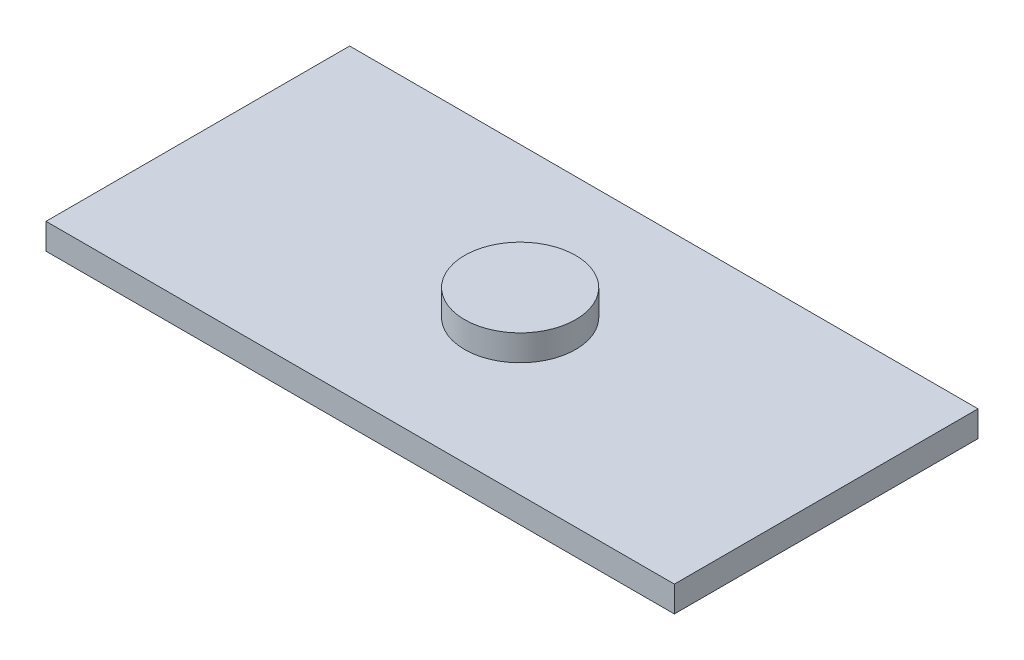
ISO-10303-21;
HEADER;
FILE_DESCRIPTION(('STEP AP214'),'2;1');
FILE_NAME('part.step','',(''),(''),'','','');
FILE_SCHEMA(('AUTOMOTIVE_DESIGN { 1 0 10303 214 1 1 1 1 }'));
ENDSEC;
DATA;
#1=APPLICATION_CONTEXT('core data for automotive mechanical design processes');
#2=APPLICATION_PROTOCOL_DEFINITION('international standard','automotive_design',2000,#1);
#3=PRODUCT_CONTEXT('',#1,'mechanical');
#4=PRODUCT('Part','Part','',(#3));
#5=PRODUCT_RELATED_PRODUCT_CATEGORY('part','',(#4));
#6=PRODUCT_DEFINITION_FORMATION('','',#4);
#7=PRODUCT_DEFINITION_CONTEXT('part definition',#1,'design');
#8=PRODUCT_DEFINITION('design','',#6,#7);
#9=PRODUCT_DEFINITION_SHAPE('','',#8);
#10=(LENGTH_UNIT() NAMED_UNIT(*) SI_UNIT(.MILLI.,.METRE.));
#11=(NAMED_UNIT(*) PLANE_ANGLE_UNIT() SI_UNIT($,.RADIAN.));
#12=(NAMED_UNIT(*) SI_UNIT($,.STERADIAN.) SOLID_ANGLE_UNIT());
#13=UNCERTAINTY_MEASURE_WITH_UNIT(LENGTH_MEASURE(1.E-05),#10,'distance_accuracy_value','');
#14=(GEOMETRIC_REPRESENTATION_CONTEXT(3) GLOBAL_UNCERTAINTY_ASSIGNED_CONTEXT((#13)) GLOBAL_UNIT_ASSIGNED_CONTEXT((#10,
#11,#12)) REPRESENTATION_CONTEXT('',''));
#15=CARTESIAN_POINT('',(0.,0.,0.));
#16=DIRECTION('',(0.,0.,1.));
#17=DIRECTION('',(1.,0.,0.));
#18=AXIS2_PLACEMENT_3D('',#15,#16,#17);
#19=CARTESIAN_POINT('',(0.,2.5,0.));
#20=DIRECTION('',(1.,0.,0.));
#21=DIRECTION('',(0.,0.,-1.));
#22=AXIS2_PLACEMENT_3D('',#19,#20,#21);
#23=PLANE('',#22);
#24=DIRECTION('',(0.,0.,1.));
#25=VECTOR('',#24,1.);
#26=CARTESIAN_POINT('',(0.,0.,0.));
#27=LINE('',#26,#25);
#28=CARTESIAN_POINT('',(0.,0.,-29.319524904934));
#29=VERTEX_POINT('',#28);
#30=CARTESIAN_POINT('',(0.,0.,0.));
#31=VERTEX_POINT('',#30);
#32=EDGE_CURVE('E110',#29,#31,#27,.T.);
#33=ORIENTED_EDGE('',*,*,#32,.T.);
#34=DIRECTION('',(0.,-1.,0.));
#35=VECTOR('',#34,1.);
#36=CARTESIAN_POINT('',(0.,2.5,0.));
#37=LINE('',#36,#35);
#38=CARTESIAN_POINT('',(0.,2.5,0.));
#39=VERTEX_POINT('',#38);
#40=EDGE_CURVE('E42',#39,#31,#37,.T.);
#41=ORIENTED_EDGE('',*,*,#40,.F.);
#42=DIRECTION('',(0.,0.,1.));
#43=VECTOR('',#42,1.);
#44=CARTESIAN_POINT('',(0.,2.5,0.));
#45=LINE('',#44,#43);
#46=CARTESIAN_POINT('',(0.,2.5,-29.319524904934));
#47=VERTEX_POINT('',#46);
#48=EDGE_CURVE('E93',#47,#39,#45,.T.);
#49=ORIENTED_EDGE('',*,*,#48,.F.);
#50=DIRECTION('',(0.,-1.,0.));
#51=VECTOR('',#50,1.);
#52=CARTESIAN_POINT('',(0.,2.5,-29.319524904934));
#53=LINE('',#52,#51);
#54=EDGE_CURVE('E106',#47,#29,#53,.T.);
#55=ORIENTED_EDGE('',*,*,#54,.T.);
#56=EDGE_LOOP('',(#33,#41,#49,#55));
#57=FACE_BOUND('',#56,.T.);
#58=ADVANCED_FACE('F39',(#57),#23,.F.);
#59=CARTESIAN_POINT('',(0.,2.5,0.));
#60=DIRECTION('',(0.,0.,-1.));
#61=DIRECTION('',(-1.,0.,0.));
#62=AXIS2_PLACEMENT_3D('',#59,#60,#61);
#63=PLANE('',#62);
#64=DIRECTION('',(1.,0.,0.));
#65=VECTOR('',#64,1.);
#66=CARTESIAN_POINT('',(0.,0.,0.));
#67=LINE('',#66,#65);
#68=CARTESIAN_POINT('',(60.6751279282662,0.,0.));
#69=VERTEX_POINT('',#68);
#70=EDGE_CURVE('E99',#31,#69,#67,.T.);
#71=ORIENTED_EDGE('',*,*,#70,.T.);
#72=DIRECTION('',(0.,-1.,0.));
#73=VECTOR('',#72,1.);
#74=CARTESIAN_POINT('',(60.6751279282662,2.5,0.));
#75=LINE('',#74,#73);
#76=CARTESIAN_POINT('',(60.6751279282662,2.5,0.));
#77=VERTEX_POINT('',#76);
#78=EDGE_CURVE('E97',#77,#69,#75,.T.);
#79=ORIENTED_EDGE('',*,*,#78,.F.);
#80=DIRECTION('',(1.,0.,0.));
#81=VECTOR('',#80,1.);
#82=CARTESIAN_POINT('',(0.,2.5,0.));
#83=LINE('',#82,#81);
#84=EDGE_CURVE('E88',#39,#77,#83,.T.);
#85=ORIENTED_EDGE('',*,*,#84,.F.);
#86=ORIENTED_EDGE('',*,*,#40,.T.);
#87=EDGE_LOOP('',(#71,#79,#85,#86));
#88=FACE_BOUND('',#87,.T.);
#89=ADVANCED_FACE('F98',(#88),#63,.F.);
#90=CARTESIAN_POINT('',(60.6751279282662,2.5,0.));
#91=DIRECTION('',(-1.,0.,0.));
#92=DIRECTION('',(0.,0.,1.));
#93=AXIS2_PLACEMENT_3D('',#90,#91,#92);
#94=PLANE('',#93);
#95=DIRECTION('',(0.,0.,-1.));
#96=VECTOR('',#95,1.);
#97=CARTESIAN_POINT('',(60.6751279282662,0.,0.));
#98=LINE('',#97,#96);
#99=CARTESIAN_POINT('',(60.6751279282662,0.,-29.319524904934));
#100=VERTEX_POINT('',#99);
#101=EDGE_CURVE('E74',#69,#100,#98,.T.);
#102=ORIENTED_EDGE('',*,*,#101,.T.);
#103=DIRECTION('',(0.,-1.,0.));
#104=VECTOR('',#103,1.);
#105=CARTESIAN_POINT('',(60.6751279282662,2.5,-29.319524904934));
#106=LINE('',#105,#104);
#107=CARTESIAN_POINT('',(60.6751279282662,2.5,-29.319524904934));
#108=VERTEX_POINT('',#107);
#109=EDGE_CURVE('E101',#108,#100,#106,.T.);
#110=ORIENTED_EDGE('',*,*,#109,.F.);
#111=DIRECTION('',(0.,0.,-1.));
#112=VECTOR('',#111,1.);
#113=CARTESIAN_POINT('',(60.6751279282662,2.5,0.));
#114=LINE('',#113,#112);
#115=EDGE_CURVE('E91',#77,#108,#114,.T.);
#116=ORIENTED_EDGE('',*,*,#115,.F.);
#117=ORIENTED_EDGE('',*,*,#78,.T.);
#118=EDGE_LOOP('',(#102,#110,#116,#117));
#119=FACE_BOUND('',#118,.T.);
#120=ADVANCED_FACE('F102',(#119),#94,.F.);
#121=CARTESIAN_POINT('',(0.,2.5,-29.319524904934));
#122=DIRECTION('',(0.,0.,1.));
#123=DIRECTION('',(1.,0.,0.));
#124=AXIS2_PLACEMENT_3D('',#121,#122,#123);
#125=PLANE('',#124);
#126=DIRECTION('',(-1.,0.,0.));
#127=VECTOR('',#126,1.);
#128=CARTESIAN_POINT('',(0.,0.,-29.319524904934));
#129=LINE('',#128,#127);
#130=EDGE_CURVE('E80',#100,#29,#129,.T.);
#131=ORIENTED_EDGE('',*,*,#130,.T.);
#132=ORIENTED_EDGE('',*,*,#54,.F.);
#133=DIRECTION('',(-1.,0.,0.));
#134=VECTOR('',#133,1.);
#135=CARTESIAN_POINT('',(0.,2.5,-29.319524904934));
#136=LINE('',#135,#134);
#137=EDGE_CURVE('E57',#108,#47,#136,.T.);
#138=ORIENTED_EDGE('',*,*,#137,.F.);
#139=ORIENTED_EDGE('',*,*,#109,.T.);
#140=EDGE_LOOP('',(#131,#132,#138,#139));
#141=FACE_BOUND('',#140,.T.);
#142=ADVANCED_FACE('F124',(#141),#125,.F.);
#143=CARTESIAN_POINT('',(0.,2.5,0.));
#144=DIRECTION('',(0.,-1.,0.));
#145=DIRECTION('',(0.,0.,-1.));
#146=AXIS2_PLACEMENT_3D('',#143,#144,#145);
#147=PLANE('',#146);
#148=CARTESIAN_POINT('',(30.9271096587442,2.5,-14.8562776840041));
#149=DIRECTION('',(0.,1.,0.));
#150=DIRECTION('',(0.,0.,1.));
#151=AXIS2_PLACEMENT_3D('',#148,#149,#150);
#152=CIRCLE('',#151,5.36921906265225);
#153=CARTESIAN_POINT('',(30.9271096587442,2.5,-9.48705862135181));
#154=VERTEX_POINT('',#153);
#155=EDGE_CURVE('E11',#154,#154,#152,.T.);
#156=ORIENTED_EDGE('',*,*,#155,.F.);
#157=EDGE_LOOP('',(#156));
#158=FACE_BOUND('',#157,.T.);
#159=ORIENTED_EDGE('',*,*,#48,.T.);
#160=ORIENTED_EDGE('',*,*,#84,.T.);
#161=ORIENTED_EDGE('',*,*,#115,.T.);
#162=ORIENTED_EDGE('',*,*,#137,.T.);
#163=EDGE_LOOP('',(#159,#160,#161,#162));
#164=FACE_BOUND('',#163,.T.);
#165=ADVANCED_FACE('F89',(#158,#164),#147,.F.);
#166=CARTESIAN_POINT('',(0.,0.,0.));
#167=DIRECTION('',(0.,-1.,0.));
#168=DIRECTION('',(0.,0.,-1.));
#169=AXIS2_PLACEMENT_3D('',#166,#167,#168);
#170=PLANE('',#169);
#171=ORIENTED_EDGE('',*,*,#32,.F.);
#172=ORIENTED_EDGE('',*,*,#130,.F.);
#173=ORIENTED_EDGE('',*,*,#101,.F.);
#174=ORIENTED_EDGE('',*,*,#70,.F.);
#175=EDGE_LOOP('',(#171,#172,#173,#174));
#176=FACE_BOUND('',#175,.T.);
#177=ADVANCED_FACE('F127',(#176),#170,.T.);
#178=CARTESIAN_POINT('',(30.9271096587442,5.,-14.8562776840041));
#179=DIRECTION('',(0.,-1.,0.));
#180=DIRECTION('',(0.,0.,-1.));
#181=AXIS2_PLACEMENT_3D('',#178,#179,#180);
#182=CYLINDRICAL_SURFACE('',#181,5.36921906265225);
#183=CARTESIAN_POINT('',(30.9271096587442,5.,-14.8562776840041));
#184=DIRECTION('',(0.,1.,0.));
#185=DIRECTION('',(0.,0.,1.));
#186=AXIS2_PLACEMENT_3D('',#183,#184,#185);
#187=CIRCLE('',#186,5.36921906265225);
#188=CARTESIAN_POINT('',(30.9271096587442,5.,-9.48705862135181));
#189=VERTEX_POINT('',#188);
#190=EDGE_CURVE('E114',#189,#189,#187,.T.);
#191=ORIENTED_EDGE('',*,*,#190,.F.);
#192=EDGE_LOOP('',(#191));
#193=FACE_BOUND('',#192,.T.);
#194=ORIENTED_EDGE('',*,*,#155,.T.);
#195=EDGE_LOOP('',(#194));
#196=FACE_BOUND('',#195,.T.);
#197=ADVANCED_FACE('F137',(#193,#196),#182,.T.);
#198=CARTESIAN_POINT('',(30.9271096587442,5.,-14.8562776840041));
#199=DIRECTION('',(0.,1.,0.));
#200=DIRECTION('',(0.,0.,1.));
#201=AXIS2_PLACEMENT_3D('',#198,#199,#200);
#202=PLANE('',#201);
#203=ORIENTED_EDGE('',*,*,#190,.T.);
#204=EDGE_LOOP('',(#203));
#205=FACE_BOUND('',#204,.T.);
#206=ADVANCED_FACE('F135',(#205),#202,.T.);
#207=CLOSED_SHELL('',(#58,#89,#120,#142,#165,#177,#197,#206));
#208=MANIFOLD_SOLID_BREP('B2',#207);
#209=ADVANCED_BREP_SHAPE_REPRESENTATION('',(#18,#208),#14);
#210=SHAPE_DEFINITION_REPRESENTATION(#9,#209);
ENDSEC;
END-ISO-10303-21;
